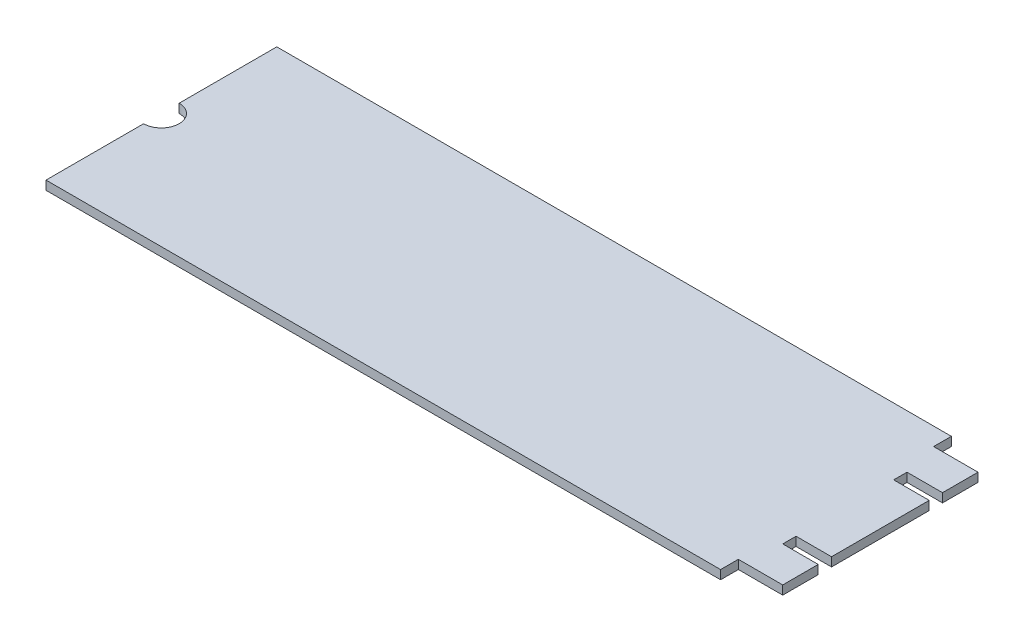
ISO-10303-21;
HEADER;
FILE_DESCRIPTION(('STEP AP214'),'2;1');
FILE_NAME('part.step','',(''),(''),'','','');
FILE_SCHEMA(('AUTOMOTIVE_DESIGN { 1 0 10303 214 1 1 1 1 }'));
ENDSEC;
DATA;
#1=APPLICATION_CONTEXT('core data for automotive mechanical design processes');
#2=APPLICATION_PROTOCOL_DEFINITION('international standard','automotive_design',2000,#1);
#3=PRODUCT_CONTEXT('',#1,'mechanical');
#4=PRODUCT('Part','Part','',(#3));
#5=PRODUCT_RELATED_PRODUCT_CATEGORY('part','',(#4));
#6=PRODUCT_DEFINITION_FORMATION('','',#4);
#7=PRODUCT_DEFINITION_CONTEXT('part definition',#1,'design');
#8=PRODUCT_DEFINITION('design','',#6,#7);
#9=PRODUCT_DEFINITION_SHAPE('','',#8);
#10=(LENGTH_UNIT() NAMED_UNIT(*) SI_UNIT(.MILLI.,.METRE.));
#11=(NAMED_UNIT(*) PLANE_ANGLE_UNIT() SI_UNIT($,.RADIAN.));
#12=(NAMED_UNIT(*) SI_UNIT($,.STERADIAN.) SOLID_ANGLE_UNIT());
#13=UNCERTAINTY_MEASURE_WITH_UNIT(LENGTH_MEASURE(1.E-05),#10,'distance_accuracy_value','');
#14=(GEOMETRIC_REPRESENTATION_CONTEXT(3) GLOBAL_UNCERTAINTY_ASSIGNED_CONTEXT((#13)) GLOBAL_UNIT_ASSIGNED_CONTEXT((#10,
#11,#12)) REPRESENTATION_CONTEXT('',''));
#15=CARTESIAN_POINT('',(0.,0.,0.));
#16=DIRECTION('',(0.,0.,1.));
#17=DIRECTION('',(1.,0.,0.));
#18=AXIS2_PLACEMENT_3D('',#15,#16,#17);
#19=CARTESIAN_POINT('',(0.,1.,-11.));
#20=DIRECTION('',(1.,0.,0.));
#21=DIRECTION('',(0.,0.,-1.));
#22=AXIS2_PLACEMENT_3D('',#19,#20,#21);
#23=PLANE('',#22);
#24=DIRECTION('',(0.,0.,1.));
#25=VECTOR('',#24,1.);
#26=CARTESIAN_POINT('',(0.,0.,-11.));
#27=LINE('',#26,#25);
#28=CARTESIAN_POINT('',(0.,0.,-11.));
#29=VERTEX_POINT('',#28);
#30=CARTESIAN_POINT('',(0.,0.,0.));
#31=VERTEX_POINT('',#30);
#32=EDGE_CURVE('E189',#29,#31,#27,.T.);
#33=ORIENTED_EDGE('',*,*,#32,.T.);
#34=DIRECTION('',(0.,-1.,0.));
#35=VECTOR('',#34,1.);
#36=CARTESIAN_POINT('',(0.,1.,0.));
#37=LINE('',#36,#35);
#38=CARTESIAN_POINT('',(0.,1.,0.));
#39=VERTEX_POINT('',#38);
#40=EDGE_CURVE('E11',#39,#31,#37,.T.);
#41=ORIENTED_EDGE('',*,*,#40,.F.);
#42=DIRECTION('',(0.,0.,1.));
#43=VECTOR('',#42,1.);
#44=CARTESIAN_POINT('',(0.,1.,-11.));
#45=LINE('',#44,#43);
#46=CARTESIAN_POINT('',(0.,1.,-11.));
#47=VERTEX_POINT('',#46);
#48=EDGE_CURVE('E223',#47,#39,#45,.T.);
#49=ORIENTED_EDGE('',*,*,#48,.F.);
#50=DIRECTION('',(0.,-1.,0.));
#51=VECTOR('',#50,1.);
#52=CARTESIAN_POINT('',(0.,1.,-11.));
#53=LINE('',#52,#51);
#54=EDGE_CURVE('E185',#47,#29,#53,.T.);
#55=ORIENTED_EDGE('',*,*,#54,.T.);
#56=EDGE_LOOP('',(#33,#41,#49,#55));
#57=FACE_BOUND('',#56,.T.);
#58=ADVANCED_FACE('F33',(#57),#23,.F.);
#59=CARTESIAN_POINT('',(0.,1.,0.));
#60=DIRECTION('',(0.,0.,-1.));
#61=DIRECTION('',(-1.,0.,0.));
#62=AXIS2_PLACEMENT_3D('',#59,#60,#61);
#63=PLANE('',#62);
#64=DIRECTION('',(1.,0.,0.));
#65=VECTOR('',#64,1.);
#66=CARTESIAN_POINT('',(0.,0.,0.));
#67=LINE('',#66,#65);
#68=CARTESIAN_POINT('',(76.,0.,0.));
#69=VERTEX_POINT('',#68);
#70=EDGE_CURVE('E192',#31,#69,#67,.T.);
#71=ORIENTED_EDGE('',*,*,#70,.T.);
#72=DIRECTION('',(0.,-1.,0.));
#73=VECTOR('',#72,1.);
#74=CARTESIAN_POINT('',(76.,1.,0.));
#75=LINE('',#74,#73);
#76=CARTESIAN_POINT('',(76.,1.,0.));
#77=VERTEX_POINT('',#76);
#78=EDGE_CURVE('E41',#77,#69,#75,.T.);
#79=ORIENTED_EDGE('',*,*,#78,.F.);
#80=DIRECTION('',(1.,0.,0.));
#81=VECTOR('',#80,1.);
#82=CARTESIAN_POINT('',(0.,1.,0.));
#83=LINE('',#82,#81);
#84=EDGE_CURVE('E122',#39,#77,#83,.T.);
#85=ORIENTED_EDGE('',*,*,#84,.F.);
#86=ORIENTED_EDGE('',*,*,#40,.T.);
#87=EDGE_LOOP('',(#71,#79,#85,#86));
#88=FACE_BOUND('',#87,.T.);
#89=ADVANCED_FACE('F331',(#88),#63,.F.);
#90=CARTESIAN_POINT('',(76.,1.,0.));
#91=DIRECTION('',(-1.,0.,0.));
#92=DIRECTION('',(0.,0.,1.));
#93=AXIS2_PLACEMENT_3D('',#90,#91,#92);
#94=PLANE('',#93);
#95=DIRECTION('',(0.,0.,-1.));
#96=VECTOR('',#95,1.);
#97=CARTESIAN_POINT('',(76.,0.,0.));
#98=LINE('',#97,#96);
#99=CARTESIAN_POINT('',(76.,0.,-2.));
#100=VERTEX_POINT('',#99);
#101=EDGE_CURVE('E194',#69,#100,#98,.T.);
#102=ORIENTED_EDGE('',*,*,#101,.T.);
#103=DIRECTION('',(0.,-1.,0.));
#104=VECTOR('',#103,1.);
#105=CARTESIAN_POINT('',(76.,1.,-2.));
#106=LINE('',#105,#104);
#107=CARTESIAN_POINT('',(76.,1.,-2.));
#108=VERTEX_POINT('',#107);
#109=EDGE_CURVE('E260',#108,#100,#106,.T.);
#110=ORIENTED_EDGE('',*,*,#109,.F.);
#111=DIRECTION('',(0.,0.,-1.));
#112=VECTOR('',#111,1.);
#113=CARTESIAN_POINT('',(76.,1.,0.));
#114=LINE('',#113,#112);
#115=EDGE_CURVE('E268',#77,#108,#114,.T.);
#116=ORIENTED_EDGE('',*,*,#115,.F.);
#117=ORIENTED_EDGE('',*,*,#78,.T.);
#118=EDGE_LOOP('',(#102,#110,#116,#117));
#119=FACE_BOUND('',#118,.T.);
#120=ADVANCED_FACE('F266',(#119),#94,.F.);
#121=CARTESIAN_POINT('',(76.,1.,-2.));
#122=DIRECTION('',(0.,0.,-1.));
#123=DIRECTION('',(-1.,0.,0.));
#124=AXIS2_PLACEMENT_3D('',#121,#122,#123);
#125=PLANE('',#124);
#126=DIRECTION('',(1.,0.,0.));
#127=VECTOR('',#126,1.);
#128=CARTESIAN_POINT('',(76.,0.,-2.));
#129=LINE('',#128,#127);
#130=CARTESIAN_POINT('',(81.,0.,-2.));
#131=VERTEX_POINT('',#130);
#132=EDGE_CURVE('E196',#100,#131,#129,.T.);
#133=ORIENTED_EDGE('',*,*,#132,.T.);
#134=DIRECTION('',(0.,-1.,0.));
#135=VECTOR('',#134,1.);
#136=CARTESIAN_POINT('',(81.,1.,-2.));
#137=LINE('',#136,#135);
#138=CARTESIAN_POINT('',(81.,1.,-2.));
#139=VERTEX_POINT('',#138);
#140=EDGE_CURVE('E257',#139,#131,#137,.T.);
#141=ORIENTED_EDGE('',*,*,#140,.F.);
#142=DIRECTION('',(1.,0.,0.));
#143=VECTOR('',#142,1.);
#144=CARTESIAN_POINT('',(76.,1.,-2.));
#145=LINE('',#144,#143);
#146=EDGE_CURVE('E286',#108,#139,#145,.T.);
#147=ORIENTED_EDGE('',*,*,#146,.F.);
#148=ORIENTED_EDGE('',*,*,#109,.T.);
#149=EDGE_LOOP('',(#133,#141,#147,#148));
#150=FACE_BOUND('',#149,.T.);
#151=ADVANCED_FACE('F277',(#150),#125,.F.);
#152=CARTESIAN_POINT('',(81.,1.,-2.));
#153=DIRECTION('',(-1.,0.,0.));
#154=DIRECTION('',(0.,0.,1.));
#155=AXIS2_PLACEMENT_3D('',#152,#153,#154);
#156=PLANE('',#155);
#157=DIRECTION('',(0.,0.,-1.));
#158=VECTOR('',#157,1.);
#159=CARTESIAN_POINT('',(81.,0.,-2.));
#160=LINE('',#159,#158);
#161=CARTESIAN_POINT('',(81.,0.,-6.));
#162=VERTEX_POINT('',#161);
#163=EDGE_CURVE('E198',#131,#162,#160,.T.);
#164=ORIENTED_EDGE('',*,*,#163,.T.);
#165=DIRECTION('',(0.,-1.,0.));
#166=VECTOR('',#165,1.);
#167=CARTESIAN_POINT('',(81.,1.,-6.));
#168=LINE('',#167,#166);
#169=CARTESIAN_POINT('',(81.,1.,-6.));
#170=VERTEX_POINT('',#169);
#171=EDGE_CURVE('E254',#170,#162,#168,.T.);
#172=ORIENTED_EDGE('',*,*,#171,.F.);
#173=DIRECTION('',(0.,0.,-1.));
#174=VECTOR('',#173,1.);
#175=CARTESIAN_POINT('',(81.,1.,-2.));
#176=LINE('',#175,#174);
#177=EDGE_CURVE('E283',#139,#170,#176,.T.);
#178=ORIENTED_EDGE('',*,*,#177,.F.);
#179=ORIENTED_EDGE('',*,*,#140,.T.);
#180=EDGE_LOOP('',(#164,#172,#178,#179));
#181=FACE_BOUND('',#180,.T.);
#182=ADVANCED_FACE('F281',(#181),#156,.F.);
#183=CARTESIAN_POINT('',(81.,1.,-6.));
#184=DIRECTION('',(0.,0.,1.));
#185=DIRECTION('',(1.,0.,0.));
#186=AXIS2_PLACEMENT_3D('',#183,#184,#185);
#187=PLANE('',#186);
#188=DIRECTION('',(-1.,0.,0.));
#189=VECTOR('',#188,1.);
#190=CARTESIAN_POINT('',(81.,0.,-6.));
#191=LINE('',#190,#189);
#192=CARTESIAN_POINT('',(77.,0.,-6.));
#193=VERTEX_POINT('',#192);
#194=EDGE_CURVE('E200',#162,#193,#191,.T.);
#195=ORIENTED_EDGE('',*,*,#194,.T.);
#196=DIRECTION('',(0.,-1.,0.));
#197=VECTOR('',#196,1.);
#198=CARTESIAN_POINT('',(77.,1.,-6.));
#199=LINE('',#198,#197);
#200=CARTESIAN_POINT('',(77.,1.,-6.));
#201=VERTEX_POINT('',#200);
#202=EDGE_CURVE('E251',#201,#193,#199,.T.);
#203=ORIENTED_EDGE('',*,*,#202,.F.);
#204=DIRECTION('',(-1.,0.,0.));
#205=VECTOR('',#204,1.);
#206=CARTESIAN_POINT('',(81.,1.,-6.));
#207=LINE('',#206,#205);
#208=EDGE_CURVE('E285',#170,#201,#207,.T.);
#209=ORIENTED_EDGE('',*,*,#208,.F.);
#210=ORIENTED_EDGE('',*,*,#171,.T.);
#211=EDGE_LOOP('',(#195,#203,#209,#210));
#212=FACE_BOUND('',#211,.T.);
#213=ADVANCED_FACE('F344',(#212),#187,.F.);
#214=CARTESIAN_POINT('',(77.,1.,-6.));
#215=DIRECTION('',(-1.,0.,0.));
#216=DIRECTION('',(0.,0.,1.));
#217=AXIS2_PLACEMENT_3D('',#214,#215,#216);
#218=PLANE('',#217);
#219=DIRECTION('',(0.,0.,-1.));
#220=VECTOR('',#219,1.);
#221=CARTESIAN_POINT('',(77.,0.,-6.));
#222=LINE('',#221,#220);
#223=CARTESIAN_POINT('',(77.,0.,-7.5));
#224=VERTEX_POINT('',#223);
#225=EDGE_CURVE('E202',#193,#224,#222,.T.);
#226=ORIENTED_EDGE('',*,*,#225,.T.);
#227=DIRECTION('',(0.,-1.,0.));
#228=VECTOR('',#227,1.);
#229=CARTESIAN_POINT('',(77.,1.,-7.5));
#230=LINE('',#229,#228);
#231=CARTESIAN_POINT('',(77.,1.,-7.5));
#232=VERTEX_POINT('',#231);
#233=EDGE_CURVE('E248',#232,#224,#230,.T.);
#234=ORIENTED_EDGE('',*,*,#233,.F.);
#235=DIRECTION('',(0.,0.,-1.));
#236=VECTOR('',#235,1.);
#237=CARTESIAN_POINT('',(77.,1.,-6.));
#238=LINE('',#237,#236);
#239=EDGE_CURVE('E288',#201,#232,#238,.T.);
#240=ORIENTED_EDGE('',*,*,#239,.F.);
#241=ORIENTED_EDGE('',*,*,#202,.T.);
#242=EDGE_LOOP('',(#226,#234,#240,#241));
#243=FACE_BOUND('',#242,.T.);
#244=ADVANCED_FACE('F347',(#243),#218,.F.);
#245=CARTESIAN_POINT('',(77.,1.,-7.5));
#246=DIRECTION('',(0.,0.,-1.));
#247=DIRECTION('',(-1.,0.,0.));
#248=AXIS2_PLACEMENT_3D('',#245,#246,#247);
#249=PLANE('',#248);
#250=DIRECTION('',(1.,0.,0.));
#251=VECTOR('',#250,1.);
#252=CARTESIAN_POINT('',(77.,0.,-7.5));
#253=LINE('',#252,#251);
#254=CARTESIAN_POINT('',(81.,0.,-7.5));
#255=VERTEX_POINT('',#254);
#256=EDGE_CURVE('E204',#224,#255,#253,.T.);
#257=ORIENTED_EDGE('',*,*,#256,.T.);
#258=DIRECTION('',(0.,-1.,0.));
#259=VECTOR('',#258,1.);
#260=CARTESIAN_POINT('',(81.,1.,-7.5));
#261=LINE('',#260,#259);
#262=CARTESIAN_POINT('',(81.,1.,-7.5));
#263=VERTEX_POINT('',#262);
#264=EDGE_CURVE('E245',#263,#255,#261,.T.);
#265=ORIENTED_EDGE('',*,*,#264,.F.);
#266=DIRECTION('',(1.,0.,0.));
#267=VECTOR('',#266,1.);
#268=CARTESIAN_POINT('',(77.,1.,-7.5));
#269=LINE('',#268,#267);
#270=EDGE_CURVE('E294',#232,#263,#269,.T.);
#271=ORIENTED_EDGE('',*,*,#270,.F.);
#272=ORIENTED_EDGE('',*,*,#233,.T.);
#273=EDGE_LOOP('',(#257,#265,#271,#272));
#274=FACE_BOUND('',#273,.T.);
#275=ADVANCED_FACE('F351',(#274),#249,.F.);
#276=CARTESIAN_POINT('',(81.,1.,-7.5));
#277=DIRECTION('',(-1.,0.,0.));
#278=DIRECTION('',(0.,0.,1.));
#279=AXIS2_PLACEMENT_3D('',#276,#277,#278);
#280=PLANE('',#279);
#281=DIRECTION('',(0.,0.,-1.));
#282=VECTOR('',#281,1.);
#283=CARTESIAN_POINT('',(81.,0.,-7.5));
#284=LINE('',#283,#282);
#285=CARTESIAN_POINT('',(81.,0.,-18.5));
#286=VERTEX_POINT('',#285);
#287=EDGE_CURVE('E206',#255,#286,#284,.T.);
#288=ORIENTED_EDGE('',*,*,#287,.T.);
#289=DIRECTION('',(0.,-1.,0.));
#290=VECTOR('',#289,1.);
#291=CARTESIAN_POINT('',(81.,1.,-18.5));
#292=LINE('',#291,#290);
#293=CARTESIAN_POINT('',(81.,1.,-18.5));
#294=VERTEX_POINT('',#293);
#295=EDGE_CURVE('E242',#294,#286,#292,.T.);
#296=ORIENTED_EDGE('',*,*,#295,.F.);
#297=DIRECTION('',(0.,0.,-1.));
#298=VECTOR('',#297,1.);
#299=CARTESIAN_POINT('',(81.,1.,-7.5));
#300=LINE('',#299,#298);
#301=EDGE_CURVE('E296',#263,#294,#300,.T.);
#302=ORIENTED_EDGE('',*,*,#301,.F.);
#303=ORIENTED_EDGE('',*,*,#264,.T.);
#304=EDGE_LOOP('',(#288,#296,#302,#303));
#305=FACE_BOUND('',#304,.T.);
#306=ADVANCED_FACE('F355',(#305),#280,.F.);
#307=CARTESIAN_POINT('',(81.,1.,-18.5));
#308=DIRECTION('',(0.,0.,1.));
#309=DIRECTION('',(1.,0.,0.));
#310=AXIS2_PLACEMENT_3D('',#307,#308,#309);
#311=PLANE('',#310);
#312=DIRECTION('',(-1.,0.,0.));
#313=VECTOR('',#312,1.);
#314=CARTESIAN_POINT('',(81.,0.,-18.5));
#315=LINE('',#314,#313);
#316=CARTESIAN_POINT('',(77.,0.,-18.5));
#317=VERTEX_POINT('',#316);
#318=EDGE_CURVE('E208',#286,#317,#315,.T.);
#319=ORIENTED_EDGE('',*,*,#318,.T.);
#320=DIRECTION('',(0.,-1.,0.));
#321=VECTOR('',#320,1.);
#322=CARTESIAN_POINT('',(77.,1.,-18.5));
#323=LINE('',#322,#321);
#324=CARTESIAN_POINT('',(77.,1.,-18.5));
#325=VERTEX_POINT('',#324);
#326=EDGE_CURVE('E239',#325,#317,#323,.T.);
#327=ORIENTED_EDGE('',*,*,#326,.F.);
#328=DIRECTION('',(-1.,0.,0.));
#329=VECTOR('',#328,1.);
#330=CARTESIAN_POINT('',(81.,1.,-18.5));
#331=LINE('',#330,#329);
#332=EDGE_CURVE('E298',#294,#325,#331,.T.);
#333=ORIENTED_EDGE('',*,*,#332,.F.);
#334=ORIENTED_EDGE('',*,*,#295,.T.);
#335=EDGE_LOOP('',(#319,#327,#333,#334));
#336=FACE_BOUND('',#335,.T.);
#337=ADVANCED_FACE('F359',(#336),#311,.F.);
#338=CARTESIAN_POINT('',(77.,1.,-18.5));
#339=DIRECTION('',(-1.,0.,0.));
#340=DIRECTION('',(0.,0.,1.));
#341=AXIS2_PLACEMENT_3D('',#338,#339,#340);
#342=PLANE('',#341);
#343=DIRECTION('',(0.,0.,-1.));
#344=VECTOR('',#343,1.);
#345=CARTESIAN_POINT('',(77.,0.,-18.5));
#346=LINE('',#345,#344);
#347=CARTESIAN_POINT('',(77.,0.,-20.));
#348=VERTEX_POINT('',#347);
#349=EDGE_CURVE('E210',#317,#348,#346,.T.);
#350=ORIENTED_EDGE('',*,*,#349,.T.);
#351=DIRECTION('',(0.,-1.,0.));
#352=VECTOR('',#351,1.);
#353=CARTESIAN_POINT('',(77.,1.,-20.));
#354=LINE('',#353,#352);
#355=CARTESIAN_POINT('',(77.,1.,-20.));
#356=VERTEX_POINT('',#355);
#357=EDGE_CURVE('E236',#356,#348,#354,.T.);
#358=ORIENTED_EDGE('',*,*,#357,.F.);
#359=DIRECTION('',(0.,0.,-1.));
#360=VECTOR('',#359,1.);
#361=CARTESIAN_POINT('',(77.,1.,-18.5));
#362=LINE('',#361,#360);
#363=EDGE_CURVE('E300',#325,#356,#362,.T.);
#364=ORIENTED_EDGE('',*,*,#363,.F.);
#365=ORIENTED_EDGE('',*,*,#326,.T.);
#366=EDGE_LOOP('',(#350,#358,#364,#365));
#367=FACE_BOUND('',#366,.T.);
#368=ADVANCED_FACE('F363',(#367),#342,.F.);
#369=CARTESIAN_POINT('',(77.,1.,-20.));
#370=DIRECTION('',(0.,0.,-1.));
#371=DIRECTION('',(-1.,0.,0.));
#372=AXIS2_PLACEMENT_3D('',#369,#370,#371);
#373=PLANE('',#372);
#374=DIRECTION('',(1.,0.,0.));
#375=VECTOR('',#374,1.);
#376=CARTESIAN_POINT('',(77.,0.,-20.));
#377=LINE('',#376,#375);
#378=CARTESIAN_POINT('',(81.,0.,-20.));
#379=VERTEX_POINT('',#378);
#380=EDGE_CURVE('E212',#348,#379,#377,.T.);
#381=ORIENTED_EDGE('',*,*,#380,.T.);
#382=DIRECTION('',(0.,-1.,0.));
#383=VECTOR('',#382,1.);
#384=CARTESIAN_POINT('',(81.,1.,-20.));
#385=LINE('',#384,#383);
#386=CARTESIAN_POINT('',(81.,1.,-20.));
#387=VERTEX_POINT('',#386);
#388=EDGE_CURVE('E233',#387,#379,#385,.T.);
#389=ORIENTED_EDGE('',*,*,#388,.F.);
#390=DIRECTION('',(1.,0.,0.));
#391=VECTOR('',#390,1.);
#392=CARTESIAN_POINT('',(77.,1.,-20.));
#393=LINE('',#392,#391);
#394=EDGE_CURVE('E302',#356,#387,#393,.T.);
#395=ORIENTED_EDGE('',*,*,#394,.F.);
#396=ORIENTED_EDGE('',*,*,#357,.T.);
#397=EDGE_LOOP('',(#381,#389,#395,#396));
#398=FACE_BOUND('',#397,.T.);
#399=ADVANCED_FACE('F367',(#398),#373,.F.);
#400=CARTESIAN_POINT('',(81.,1.,-20.));
#401=DIRECTION('',(-1.,0.,0.));
#402=DIRECTION('',(0.,0.,1.));
#403=AXIS2_PLACEMENT_3D('',#400,#401,#402);
#404=PLANE('',#403);
#405=DIRECTION('',(0.,0.,-1.));
#406=VECTOR('',#405,1.);
#407=CARTESIAN_POINT('',(81.,0.,-20.));
#408=LINE('',#407,#406);
#409=CARTESIAN_POINT('',(81.,0.,-24.));
#410=VERTEX_POINT('',#409);
#411=EDGE_CURVE('E214',#379,#410,#408,.T.);
#412=ORIENTED_EDGE('',*,*,#411,.T.);
#413=DIRECTION('',(0.,-1.,0.));
#414=VECTOR('',#413,1.);
#415=CARTESIAN_POINT('',(81.,1.,-24.));
#416=LINE('',#415,#414);
#417=CARTESIAN_POINT('',(81.,1.,-24.));
#418=VERTEX_POINT('',#417);
#419=EDGE_CURVE('E230',#418,#410,#416,.T.);
#420=ORIENTED_EDGE('',*,*,#419,.F.);
#421=DIRECTION('',(0.,0.,-1.));
#422=VECTOR('',#421,1.);
#423=CARTESIAN_POINT('',(81.,1.,-20.));
#424=LINE('',#423,#422);
#425=EDGE_CURVE('E304',#387,#418,#424,.T.);
#426=ORIENTED_EDGE('',*,*,#425,.F.);
#427=ORIENTED_EDGE('',*,*,#388,.T.);
#428=EDGE_LOOP('',(#412,#420,#426,#427));
#429=FACE_BOUND('',#428,.T.);
#430=ADVANCED_FACE('F371',(#429),#404,.F.);
#431=CARTESIAN_POINT('',(81.,1.,-24.));
#432=DIRECTION('',(0.,0.,1.));
#433=DIRECTION('',(1.,0.,0.));
#434=AXIS2_PLACEMENT_3D('',#431,#432,#433);
#435=PLANE('',#434);
#436=DIRECTION('',(-1.,0.,0.));
#437=VECTOR('',#436,1.);
#438=CARTESIAN_POINT('',(81.,0.,-24.));
#439=LINE('',#438,#437);
#440=CARTESIAN_POINT('',(76.,0.,-24.));
#441=VERTEX_POINT('',#440);
#442=EDGE_CURVE('E216',#410,#441,#439,.T.);
#443=ORIENTED_EDGE('',*,*,#442,.T.);
#444=DIRECTION('',(0.,-1.,0.));
#445=VECTOR('',#444,1.);
#446=CARTESIAN_POINT('',(76.,1.,-24.));
#447=LINE('',#446,#445);
#448=CARTESIAN_POINT('',(76.,1.,-24.));
#449=VERTEX_POINT('',#448);
#450=EDGE_CURVE('E227',#449,#441,#447,.T.);
#451=ORIENTED_EDGE('',*,*,#450,.F.);
#452=DIRECTION('',(-1.,0.,0.));
#453=VECTOR('',#452,1.);
#454=CARTESIAN_POINT('',(81.,1.,-24.));
#455=LINE('',#454,#453);
#456=EDGE_CURVE('E306',#418,#449,#455,.T.);
#457=ORIENTED_EDGE('',*,*,#456,.F.);
#458=ORIENTED_EDGE('',*,*,#419,.T.);
#459=EDGE_LOOP('',(#443,#451,#457,#458));
#460=FACE_BOUND('',#459,.T.);
#461=ADVANCED_FACE('F312',(#460),#435,.F.);
#462=CARTESIAN_POINT('',(76.,1.,-24.));
#463=DIRECTION('',(-1.,0.,0.));
#464=DIRECTION('',(0.,0.,1.));
#465=AXIS2_PLACEMENT_3D('',#462,#463,#464);
#466=PLANE('',#465);
#467=DIRECTION('',(0.,0.,-1.));
#468=VECTOR('',#467,1.);
#469=CARTESIAN_POINT('',(76.,0.,-24.));
#470=LINE('',#469,#468);
#471=CARTESIAN_POINT('',(76.,0.,-26.));
#472=VERTEX_POINT('',#471);
#473=EDGE_CURVE('E218',#441,#472,#470,.T.);
#474=ORIENTED_EDGE('',*,*,#473,.T.);
#475=DIRECTION('',(0.,-1.,0.));
#476=VECTOR('',#475,1.);
#477=CARTESIAN_POINT('',(76.,1.,-26.));
#478=LINE('',#477,#476);
#479=CARTESIAN_POINT('',(76.,1.,-26.));
#480=VERTEX_POINT('',#479);
#481=EDGE_CURVE('E180',#480,#472,#478,.T.);
#482=ORIENTED_EDGE('',*,*,#481,.F.);
#483=DIRECTION('',(0.,0.,-1.));
#484=VECTOR('',#483,1.);
#485=CARTESIAN_POINT('',(76.,1.,-24.));
#486=LINE('',#485,#484);
#487=EDGE_CURVE('E171',#449,#480,#486,.T.);
#488=ORIENTED_EDGE('',*,*,#487,.F.);
#489=ORIENTED_EDGE('',*,*,#450,.T.);
#490=EDGE_LOOP('',(#474,#482,#488,#489));
#491=FACE_BOUND('',#490,.T.);
#492=ADVANCED_FACE('F316',(#491),#466,.F.);
#493=CARTESIAN_POINT('',(76.,1.,-26.));
#494=DIRECTION('',(0.,0.,1.));
#495=DIRECTION('',(1.,0.,0.));
#496=AXIS2_PLACEMENT_3D('',#493,#494,#495);
#497=PLANE('',#496);
#498=DIRECTION('',(-1.,0.,0.));
#499=VECTOR('',#498,1.);
#500=CARTESIAN_POINT('',(76.,0.,-26.));
#501=LINE('',#500,#499);
#502=CARTESIAN_POINT('',(0.,0.,-26.));
#503=VERTEX_POINT('',#502);
#504=EDGE_CURVE('E179',#472,#503,#501,.T.);
#505=ORIENTED_EDGE('',*,*,#504,.T.);
#506=DIRECTION('',(0.,-1.,0.));
#507=VECTOR('',#506,1.);
#508=CARTESIAN_POINT('',(0.,1.,-26.));
#509=LINE('',#508,#507);
#510=CARTESIAN_POINT('',(0.,1.,-26.));
#511=VERTEX_POINT('',#510);
#512=EDGE_CURVE('E176',#511,#503,#509,.T.);
#513=ORIENTED_EDGE('',*,*,#512,.F.);
#514=DIRECTION('',(-1.,0.,0.));
#515=VECTOR('',#514,1.);
#516=CARTESIAN_POINT('',(76.,1.,-26.));
#517=LINE('',#516,#515);
#518=EDGE_CURVE('E165',#480,#511,#517,.T.);
#519=ORIENTED_EDGE('',*,*,#518,.F.);
#520=ORIENTED_EDGE('',*,*,#481,.T.);
#521=EDGE_LOOP('',(#505,#513,#519,#520));
#522=FACE_BOUND('',#521,.T.);
#523=ADVANCED_FACE('F177',(#522),#497,.F.);
#524=CARTESIAN_POINT('',(0.,1.,-26.));
#525=DIRECTION('',(1.,0.,0.));
#526=DIRECTION('',(0.,0.,-1.));
#527=AXIS2_PLACEMENT_3D('',#524,#525,#526);
#528=PLANE('',#527);
#529=DIRECTION('',(0.,0.,1.));
#530=VECTOR('',#529,1.);
#531=CARTESIAN_POINT('',(0.,0.,-26.));
#532=LINE('',#531,#530);
#533=CARTESIAN_POINT('',(0.,0.,-15.));
#534=VERTEX_POINT('',#533);
#535=EDGE_CURVE('E108',#503,#534,#532,.T.);
#536=ORIENTED_EDGE('',*,*,#535,.T.);
#537=DIRECTION('',(0.,-1.,0.));
#538=VECTOR('',#537,1.);
#539=CARTESIAN_POINT('',(0.,1.,-15.));
#540=LINE('',#539,#538);
#541=CARTESIAN_POINT('',(0.,1.,-15.));
#542=VERTEX_POINT('',#541);
#543=EDGE_CURVE('E181',#542,#534,#540,.T.);
#544=ORIENTED_EDGE('',*,*,#543,.F.);
#545=DIRECTION('',(0.,0.,1.));
#546=VECTOR('',#545,1.);
#547=CARTESIAN_POINT('',(0.,1.,-26.));
#548=LINE('',#547,#546);
#549=EDGE_CURVE('E169',#511,#542,#548,.T.);
#550=ORIENTED_EDGE('',*,*,#549,.F.);
#551=ORIENTED_EDGE('',*,*,#512,.T.);
#552=EDGE_LOOP('',(#536,#544,#550,#551));
#553=FACE_BOUND('',#552,.T.);
#554=ADVANCED_FACE('F183',(#553),#528,.F.);
#555=CARTESIAN_POINT('',(0.,1.,-13.));
#556=DIRECTION('',(0.,-1.,0.));
#557=DIRECTION('',(0.,0.,-1.));
#558=AXIS2_PLACEMENT_3D('',#555,#556,#557);
#559=CYLINDRICAL_SURFACE('',#558,2.);
#560=CARTESIAN_POINT('',(0.,0.,-13.));
#561=DIRECTION('',(0.,-1.,0.));
#562=DIRECTION('',(0.,0.,-1.));
#563=AXIS2_PLACEMENT_3D('',#560,#561,#562);
#564=CIRCLE('',#563,2.);
#565=EDGE_CURVE('E114',#534,#29,#564,.T.);
#566=ORIENTED_EDGE('',*,*,#565,.T.);
#567=ORIENTED_EDGE('',*,*,#54,.F.);
#568=CARTESIAN_POINT('',(0.,1.,-13.));
#569=DIRECTION('',(0.,-1.,0.));
#570=DIRECTION('',(0.,0.,-1.));
#571=AXIS2_PLACEMENT_3D('',#568,#569,#570);
#572=CIRCLE('',#571,2.);
#573=EDGE_CURVE('E49',#542,#47,#572,.T.);
#574=ORIENTED_EDGE('',*,*,#573,.F.);
#575=ORIENTED_EDGE('',*,*,#543,.T.);
#576=EDGE_LOOP('',(#566,#567,#574,#575));
#577=FACE_BOUND('',#576,.T.);
#578=ADVANCED_FACE('F320',(#577),#559,.F.);
#579=CARTESIAN_POINT('',(0.,1.,-13.));
#580=DIRECTION('',(0.,-1.,0.));
#581=DIRECTION('',(0.,0.,-1.));
#582=AXIS2_PLACEMENT_3D('',#579,#580,#581);
#583=PLANE('',#582);
#584=ORIENTED_EDGE('',*,*,#48,.T.);
#585=ORIENTED_EDGE('',*,*,#84,.T.);
#586=ORIENTED_EDGE('',*,*,#115,.T.);
#587=ORIENTED_EDGE('',*,*,#146,.T.);
#588=ORIENTED_EDGE('',*,*,#177,.T.);
#589=ORIENTED_EDGE('',*,*,#208,.T.);
#590=ORIENTED_EDGE('',*,*,#239,.T.);
#591=ORIENTED_EDGE('',*,*,#270,.T.);
#592=ORIENTED_EDGE('',*,*,#301,.T.);
#593=ORIENTED_EDGE('',*,*,#332,.T.);
#594=ORIENTED_EDGE('',*,*,#363,.T.);
#595=ORIENTED_EDGE('',*,*,#394,.T.);
#596=ORIENTED_EDGE('',*,*,#425,.T.);
#597=ORIENTED_EDGE('',*,*,#456,.T.);
#598=ORIENTED_EDGE('',*,*,#487,.T.);
#599=ORIENTED_EDGE('',*,*,#518,.T.);
#600=ORIENTED_EDGE('',*,*,#549,.T.);
#601=ORIENTED_EDGE('',*,*,#573,.T.);
#602=EDGE_LOOP('',(#584,#585,#586,#587,#588,#589,#590,#591,#592,#593,#594,#595,#596,#597,#598,
#599,#600,#601));
#603=FACE_BOUND('',#602,.T.);
#604=ADVANCED_FACE('F167',(#603),#583,.F.);
#605=CARTESIAN_POINT('',(0.,0.,-13.));
#606=DIRECTION('',(0.,-1.,0.));
#607=DIRECTION('',(0.,0.,-1.));
#608=AXIS2_PLACEMENT_3D('',#605,#606,#607);
#609=PLANE('',#608);
#610=ORIENTED_EDGE('',*,*,#32,.F.);
#611=ORIENTED_EDGE('',*,*,#565,.F.);
#612=ORIENTED_EDGE('',*,*,#535,.F.);
#613=ORIENTED_EDGE('',*,*,#504,.F.);
#614=ORIENTED_EDGE('',*,*,#473,.F.);
#615=ORIENTED_EDGE('',*,*,#442,.F.);
#616=ORIENTED_EDGE('',*,*,#411,.F.);
#617=ORIENTED_EDGE('',*,*,#380,.F.);
#618=ORIENTED_EDGE('',*,*,#349,.F.);
#619=ORIENTED_EDGE('',*,*,#318,.F.);
#620=ORIENTED_EDGE('',*,*,#287,.F.);
#621=ORIENTED_EDGE('',*,*,#256,.F.);
#622=ORIENTED_EDGE('',*,*,#225,.F.);
#623=ORIENTED_EDGE('',*,*,#194,.F.);
#624=ORIENTED_EDGE('',*,*,#163,.F.);
#625=ORIENTED_EDGE('',*,*,#132,.F.);
#626=ORIENTED_EDGE('',*,*,#101,.F.);
#627=ORIENTED_EDGE('',*,*,#70,.F.);
#628=EDGE_LOOP('',(#610,#611,#612,#613,#614,#615,#616,#617,#618,#619,#620,#621,#622,#623,#624,
#625,#626,#627));
#629=FACE_BOUND('',#628,.T.);
#630=ADVANCED_FACE('F272',(#629),#609,.T.);
#631=CLOSED_SHELL('',(#58,#89,#120,#151,#182,#213,#244,#275,#306,#337,#368,#399,#430,#461,#492,
#523,#554,#578,#604,#630));
#632=MANIFOLD_SOLID_BREP('B2',#631);
#633=ADVANCED_BREP_SHAPE_REPRESENTATION('',(#18,#632),#14);
#634=SHAPE_DEFINITION_REPRESENTATION(#9,#633);
ENDSEC;
END-ISO-10303-21;
